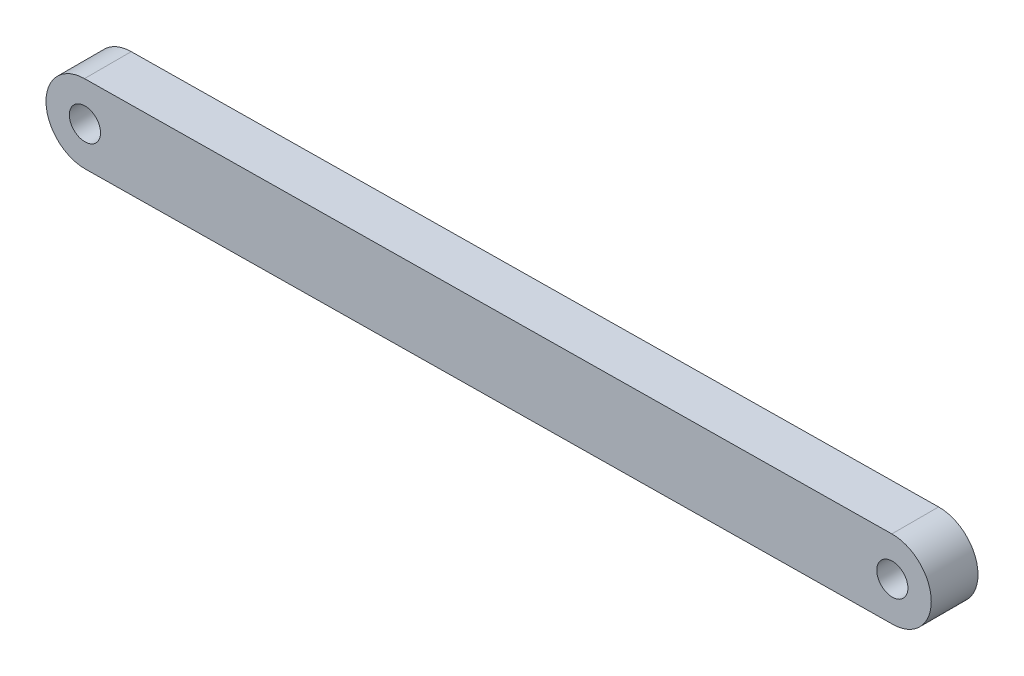
ISO-10303-21;
HEADER;
FILE_DESCRIPTION(('STEP AP214'),'2;1');
FILE_NAME('part.step','',(''),(''),'','','');
FILE_SCHEMA(('AUTOMOTIVE_DESIGN { 1 0 10303 214 1 1 1 1 }'));
ENDSEC;
DATA;
#1=APPLICATION_CONTEXT('core data for automotive mechanical design processes');
#2=APPLICATION_PROTOCOL_DEFINITION('international standard','automotive_design',2000,#1);
#3=PRODUCT_CONTEXT('',#1,'mechanical');
#4=PRODUCT('Part','Part','',(#3));
#5=PRODUCT_RELATED_PRODUCT_CATEGORY('part','',(#4));
#6=PRODUCT_DEFINITION_FORMATION('','',#4);
#7=PRODUCT_DEFINITION_CONTEXT('part definition',#1,'design');
#8=PRODUCT_DEFINITION('design','',#6,#7);
#9=PRODUCT_DEFINITION_SHAPE('','',#8);
#10=(LENGTH_UNIT() NAMED_UNIT(*) SI_UNIT(.MILLI.,.METRE.));
#11=(NAMED_UNIT(*) PLANE_ANGLE_UNIT() SI_UNIT($,.RADIAN.));
#12=(NAMED_UNIT(*) SI_UNIT($,.STERADIAN.) SOLID_ANGLE_UNIT());
#13=UNCERTAINTY_MEASURE_WITH_UNIT(LENGTH_MEASURE(1.E-05),#10,'distance_accuracy_value','');
#14=(GEOMETRIC_REPRESENTATION_CONTEXT(3) GLOBAL_UNCERTAINTY_ASSIGNED_CONTEXT((#13)) GLOBAL_UNIT_ASSIGNED_CONTEXT((#10,
#11,#12)) REPRESENTATION_CONTEXT('',''));
#15=CARTESIAN_POINT('',(0.,0.,0.));
#16=DIRECTION('',(0.,0.,1.));
#17=DIRECTION('',(1.,0.,0.));
#18=AXIS2_PLACEMENT_3D('',#15,#16,#17);
#19=CARTESIAN_POINT('',(-20.226977195946,-0.602625,3.));
#20=DIRECTION('',(0.,0.,-1.));
#21=DIRECTION('',(-1.,0.,0.));
#22=AXIS2_PLACEMENT_3D('',#19,#20,#21);
#23=CYLINDRICAL_SURFACE('',#22,2.5);
#24=CARTESIAN_POINT('',(-20.226977195946,-0.602625,0.));
#25=DIRECTION('',(0.,0.,1.));
#26=DIRECTION('',(1.,0.,0.));
#27=AXIS2_PLACEMENT_3D('',#24,#25,#26);
#28=CIRCLE('',#27,2.5);
#29=CARTESIAN_POINT('',(-20.2560482233082,1.89720596935935,0.));
#30=VERTEX_POINT('',#29);
#31=CARTESIAN_POINT('',(-20.1979061685837,-3.10245596935935,0.));
#32=VERTEX_POINT('',#31);
#33=EDGE_CURVE('E99',#30,#32,#28,.T.);
#34=ORIENTED_EDGE('',*,*,#33,.T.);
#35=DIRECTION('',(0.,0.,-1.));
#36=VECTOR('',#35,1.);
#37=CARTESIAN_POINT('',(-20.1979061685837,-3.10245596935935,3.));
#38=LINE('',#37,#36);
#39=CARTESIAN_POINT('',(-20.1979061685837,-3.10245596935935,3.));
#40=VERTEX_POINT('',#39);
#41=EDGE_CURVE('E11',#40,#32,#38,.T.);
#42=ORIENTED_EDGE('',*,*,#41,.F.);
#43=CARTESIAN_POINT('',(-20.226977195946,-0.602625,3.));
#44=DIRECTION('',(0.,0.,1.));
#45=DIRECTION('',(1.,0.,0.));
#46=AXIS2_PLACEMENT_3D('',#43,#44,#45);
#47=CIRCLE('',#46,2.5);
#48=CARTESIAN_POINT('',(-20.2560482233082,1.89720596935935,3.));
#49=VERTEX_POINT('',#48);
#50=EDGE_CURVE('E87',#49,#40,#47,.T.);
#51=ORIENTED_EDGE('',*,*,#50,.F.);
#52=DIRECTION('',(0.,0.,-1.));
#53=VECTOR('',#52,1.);
#54=CARTESIAN_POINT('',(-20.2560482233082,1.89720596935935,3.));
#55=LINE('',#54,#53);
#56=EDGE_CURVE('E95',#49,#30,#55,.T.);
#57=ORIENTED_EDGE('',*,*,#56,.T.);
#58=EDGE_LOOP('',(#34,#42,#51,#57));
#59=FACE_BOUND('',#58,.T.);
#60=ADVANCED_FACE('F36',(#59),#23,.T.);
#61=CARTESIAN_POINT('',(-20.1979061685837,-3.10245596935935,3.));
#62=DIRECTION('',(-0.0116284109448875,0.99993238774374,0.));
#63=DIRECTION('',(-0.99993238774374,-0.0116284109448875,0.));
#64=AXIS2_PLACEMENT_3D('',#61,#62,#63);
#65=PLANE('',#64);
#66=DIRECTION('',(0.99993238774374,0.0116284109448875,0.));
#67=VECTOR('',#66,1.);
#68=CARTESIAN_POINT('',(-20.1979061685837,-3.10245596935935,0.));
#69=LINE('',#68,#67);
#70=CARTESIAN_POINT('',(31.6220938314163,-2.49983096935935,0.));
#71=VERTEX_POINT('',#70);
#72=EDGE_CURVE('E91',#32,#71,#69,.T.);
#73=ORIENTED_EDGE('',*,*,#72,.T.);
#74=DIRECTION('',(0.,0.,-1.));
#75=VECTOR('',#74,1.);
#76=CARTESIAN_POINT('',(31.6220938314163,-2.49983096935935,3.));
#77=LINE('',#76,#75);
#78=CARTESIAN_POINT('',(31.6220938314163,-2.49983096935935,3.));
#79=VERTEX_POINT('',#78);
#80=EDGE_CURVE('E44',#79,#71,#77,.T.);
#81=ORIENTED_EDGE('',*,*,#80,.F.);
#82=DIRECTION('',(0.99993238774374,0.0116284109448875,0.));
#83=VECTOR('',#82,1.);
#84=CARTESIAN_POINT('',(-20.1979061685837,-3.10245596935935,3.));
#85=LINE('',#84,#83);
#86=EDGE_CURVE('E82',#40,#79,#85,.T.);
#87=ORIENTED_EDGE('',*,*,#86,.F.);
#88=ORIENTED_EDGE('',*,*,#41,.T.);
#89=EDGE_LOOP('',(#73,#81,#87,#88));
#90=FACE_BOUND('',#89,.T.);
#91=ADVANCED_FACE('F90',(#90),#65,.F.);
#92=CARTESIAN_POINT('',(31.593022804054,0.,3.));
#93=DIRECTION('',(0.,0.,-1.));
#94=DIRECTION('',(-1.,0.,0.));
#95=AXIS2_PLACEMENT_3D('',#92,#93,#94);
#96=CYLINDRICAL_SURFACE('',#95,2.5);
#97=CARTESIAN_POINT('',(31.593022804054,0.,0.));
#98=DIRECTION('',(0.,0.,1.));
#99=DIRECTION('',(1.,0.,0.));
#100=AXIS2_PLACEMENT_3D('',#97,#98,#99);
#101=CIRCLE('',#100,2.5);
#102=CARTESIAN_POINT('',(31.5639517766918,2.49983096935935,0.));
#103=VERTEX_POINT('',#102);
#104=EDGE_CURVE('E69',#71,#103,#101,.T.);
#105=ORIENTED_EDGE('',*,*,#104,.T.);
#106=DIRECTION('',(0.,0.,-1.));
#107=VECTOR('',#106,1.);
#108=CARTESIAN_POINT('',(31.5639517766918,2.49983096935935,3.));
#109=LINE('',#108,#107);
#110=CARTESIAN_POINT('',(31.5639517766918,2.49983096935935,3.));
#111=VERTEX_POINT('',#110);
#112=EDGE_CURVE('E92',#111,#103,#109,.T.);
#113=ORIENTED_EDGE('',*,*,#112,.F.);
#114=CARTESIAN_POINT('',(31.593022804054,0.,3.));
#115=DIRECTION('',(0.,0.,1.));
#116=DIRECTION('',(1.,0.,0.));
#117=AXIS2_PLACEMENT_3D('',#114,#115,#116);
#118=CIRCLE('',#117,2.5);
#119=EDGE_CURVE('E85',#79,#111,#118,.T.);
#120=ORIENTED_EDGE('',*,*,#119,.F.);
#121=ORIENTED_EDGE('',*,*,#80,.T.);
#122=EDGE_LOOP('',(#105,#113,#120,#121));
#123=FACE_BOUND('',#122,.T.);
#124=ADVANCED_FACE('F93',(#123),#96,.T.);
#125=CARTESIAN_POINT('',(-20.2560482233082,1.89720596935935,3.));
#126=DIRECTION('',(0.0116284109448875,-0.99993238774374,0.));
#127=DIRECTION('',(0.99993238774374,0.0116284109448875,0.));
#128=AXIS2_PLACEMENT_3D('',#125,#126,#127);
#129=PLANE('',#128);
#130=DIRECTION('',(-0.99993238774374,-0.0116284109448875,0.));
#131=VECTOR('',#130,1.);
#132=CARTESIAN_POINT('',(-20.2560482233082,1.89720596935935,0.));
#133=LINE('',#132,#131);
#134=EDGE_CURVE('E75',#103,#30,#133,.T.);
#135=ORIENTED_EDGE('',*,*,#134,.T.);
#136=ORIENTED_EDGE('',*,*,#56,.F.);
#137=DIRECTION('',(-0.99993238774374,-0.0116284109448875,0.));
#138=VECTOR('',#137,1.);
#139=CARTESIAN_POINT('',(-20.2560482233082,1.89720596935935,3.));
#140=LINE('',#139,#138);
#141=EDGE_CURVE('E52',#111,#49,#140,.T.);
#142=ORIENTED_EDGE('',*,*,#141,.F.);
#143=ORIENTED_EDGE('',*,*,#112,.T.);
#144=EDGE_LOOP('',(#135,#136,#142,#143));
#145=FACE_BOUND('',#144,.T.);
#146=ADVANCED_FACE('F107',(#145),#129,.F.);
#147=CARTESIAN_POINT('',(-20.226977195946,-0.602625,3.));
#148=DIRECTION('',(0.,0.,1.));
#149=DIRECTION('',(1.,0.,0.));
#150=AXIS2_PLACEMENT_3D('',#147,#148,#149);
#151=PLANE('',#150);
#152=CARTESIAN_POINT('',(31.593022804054,0.,3.));
#153=DIRECTION('',(0.,0.,1.));
#154=DIRECTION('',(1.,0.,0.));
#155=AXIS2_PLACEMENT_3D('',#152,#153,#154);
#156=CIRCLE('',#155,0.999999999999998);
#157=CARTESIAN_POINT('',(32.593022804054,0.,3.));
#158=VERTEX_POINT('',#157);
#159=EDGE_CURVE('E119',#158,#158,#156,.T.);
#160=ORIENTED_EDGE('',*,*,#159,.F.);
#161=EDGE_LOOP('',(#160));
#162=FACE_BOUND('',#161,.T.);
#163=CARTESIAN_POINT('',(-20.226977195946,-0.602625,3.));
#164=DIRECTION('',(0.,0.,1.));
#165=DIRECTION('',(1.,0.,0.));
#166=AXIS2_PLACEMENT_3D('',#163,#164,#165);
#167=CIRCLE('',#166,1.);
#168=CARTESIAN_POINT('',(-19.226977195946,-0.602625,3.));
#169=VERTEX_POINT('',#168);
#170=EDGE_CURVE('E113',#169,#169,#167,.T.);
#171=ORIENTED_EDGE('',*,*,#170,.F.);
#172=EDGE_LOOP('',(#171));
#173=FACE_BOUND('',#172,.T.);
#174=ORIENTED_EDGE('',*,*,#50,.T.);
#175=ORIENTED_EDGE('',*,*,#86,.T.);
#176=ORIENTED_EDGE('',*,*,#119,.T.);
#177=ORIENTED_EDGE('',*,*,#141,.T.);
#178=EDGE_LOOP('',(#174,#175,#176,#177));
#179=FACE_BOUND('',#178,.T.);
#180=ADVANCED_FACE('F83',(#162,#173,#179),#151,.T.);
#181=CARTESIAN_POINT('',(-20.226977195946,-0.602625,0.));
#182=DIRECTION('',(0.,0.,1.));
#183=DIRECTION('',(1.,0.,0.));
#184=AXIS2_PLACEMENT_3D('',#181,#182,#183);
#185=PLANE('',#184);
#186=CARTESIAN_POINT('',(31.593022804054,0.,0.));
#187=DIRECTION('',(0.,0.,1.));
#188=DIRECTION('',(1.,0.,0.));
#189=AXIS2_PLACEMENT_3D('',#186,#187,#188);
#190=CIRCLE('',#189,0.999999999999998);
#191=CARTESIAN_POINT('',(32.593022804054,0.,0.));
#192=VERTEX_POINT('',#191);
#193=EDGE_CURVE('E102',#192,#192,#190,.T.);
#194=ORIENTED_EDGE('',*,*,#193,.T.);
#195=EDGE_LOOP('',(#194));
#196=FACE_BOUND('',#195,.T.);
#197=CARTESIAN_POINT('',(-20.226977195946,-0.602625,0.));
#198=DIRECTION('',(0.,0.,1.));
#199=DIRECTION('',(1.,0.,0.));
#200=AXIS2_PLACEMENT_3D('',#197,#198,#199);
#201=CIRCLE('',#200,1.);
#202=CARTESIAN_POINT('',(-19.226977195946,-0.602625,0.));
#203=VERTEX_POINT('',#202);
#204=EDGE_CURVE('E116',#203,#203,#201,.T.);
#205=ORIENTED_EDGE('',*,*,#204,.T.);
#206=EDGE_LOOP('',(#205));
#207=FACE_BOUND('',#206,.T.);
#208=ORIENTED_EDGE('',*,*,#33,.F.);
#209=ORIENTED_EDGE('',*,*,#134,.F.);
#210=ORIENTED_EDGE('',*,*,#104,.F.);
#211=ORIENTED_EDGE('',*,*,#72,.F.);
#212=EDGE_LOOP('',(#208,#209,#210,#211));
#213=FACE_BOUND('',#212,.T.);
#214=ADVANCED_FACE('F110',(#196,#207,#213),#185,.F.);
#215=CARTESIAN_POINT('',(-20.226977195946,-0.602625,0.));
#216=DIRECTION('',(0.,0.,1.));
#217=DIRECTION('',(1.,0.,0.));
#218=AXIS2_PLACEMENT_3D('',#215,#216,#217);
#219=CYLINDRICAL_SURFACE('',#218,1.);
#220=ORIENTED_EDGE('',*,*,#204,.F.);
#221=EDGE_LOOP('',(#220));
#222=FACE_BOUND('',#221,.T.);
#223=ORIENTED_EDGE('',*,*,#170,.T.);
#224=EDGE_LOOP('',(#223));
#225=FACE_BOUND('',#224,.T.);
#226=ADVANCED_FACE('F130',(#222,#225),#219,.F.);
#227=CARTESIAN_POINT('',(31.593022804054,0.,0.));
#228=DIRECTION('',(0.,0.,1.));
#229=DIRECTION('',(1.,0.,0.));
#230=AXIS2_PLACEMENT_3D('',#227,#228,#229);
#231=CYLINDRICAL_SURFACE('',#230,0.999999999999998);
#232=ORIENTED_EDGE('',*,*,#193,.F.);
#233=EDGE_LOOP('',(#232));
#234=FACE_BOUND('',#233,.T.);
#235=ORIENTED_EDGE('',*,*,#159,.T.);
#236=EDGE_LOOP('',(#235));
#237=FACE_BOUND('',#236,.T.);
#238=ADVANCED_FACE('F127',(#234,#237),#231,.F.);
#239=CLOSED_SHELL('',(#60,#91,#124,#146,#180,#214,#226,#238));
#240=MANIFOLD_SOLID_BREP('B2',#239);
#241=ADVANCED_BREP_SHAPE_REPRESENTATION('',(#18,#240),#14);
#242=SHAPE_DEFINITION_REPRESENTATION(#9,#241);
ENDSEC;
END-ISO-10303-21;
